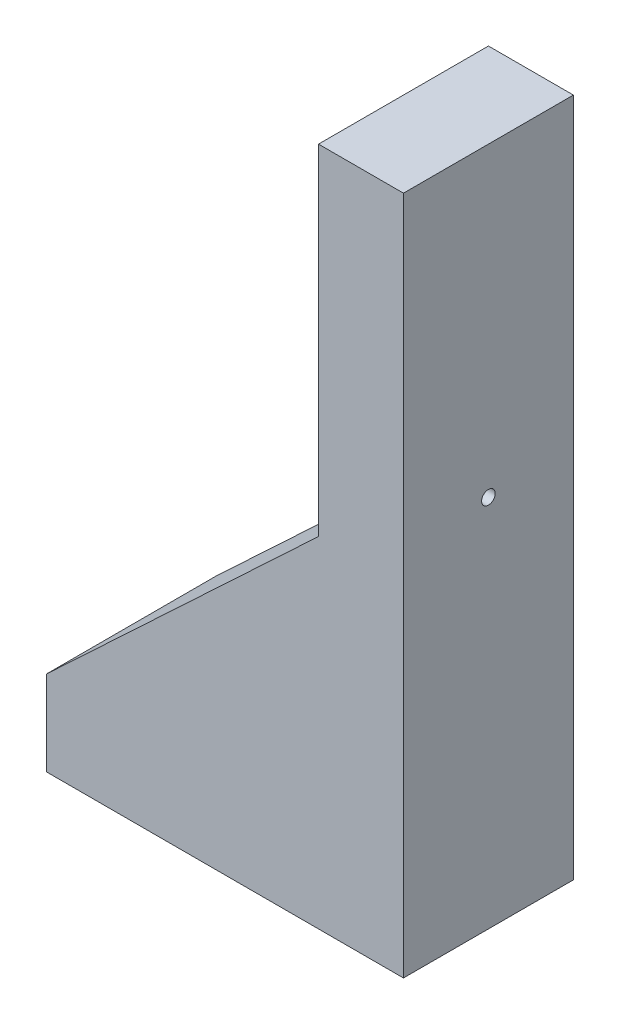
ISO-10303-21;
HEADER;
FILE_DESCRIPTION(('STEP AP214'),'2;1');
FILE_NAME('part.step','',(''),(''),'','','');
FILE_SCHEMA(('AUTOMOTIVE_DESIGN { 1 0 10303 214 1 1 1 1 }'));
ENDSEC;
DATA;
#1=APPLICATION_CONTEXT('core data for automotive mechanical design processes');
#2=APPLICATION_PROTOCOL_DEFINITION('international standard','automotive_design',2000,#1);
#3=PRODUCT_CONTEXT('',#1,'mechanical');
#4=PRODUCT('Part','Part','',(#3));
#5=PRODUCT_RELATED_PRODUCT_CATEGORY('part','',(#4));
#6=PRODUCT_DEFINITION_FORMATION('','',#4);
#7=PRODUCT_DEFINITION_CONTEXT('part definition',#1,'design');
#8=PRODUCT_DEFINITION('design','',#6,#7);
#9=PRODUCT_DEFINITION_SHAPE('','',#8);
#10=(LENGTH_UNIT() NAMED_UNIT(*) SI_UNIT(.MILLI.,.METRE.));
#11=(NAMED_UNIT(*) PLANE_ANGLE_UNIT() SI_UNIT($,.RADIAN.));
#12=(NAMED_UNIT(*) SI_UNIT($,.STERADIAN.) SOLID_ANGLE_UNIT());
#13=UNCERTAINTY_MEASURE_WITH_UNIT(LENGTH_MEASURE(1.E-05),#10,'distance_accuracy_value','');
#14=(GEOMETRIC_REPRESENTATION_CONTEXT(3) GLOBAL_UNCERTAINTY_ASSIGNED_CONTEXT((#13)) GLOBAL_UNIT_ASSIGNED_CONTEXT((#10,
#11,#12)) REPRESENTATION_CONTEXT('',''));
#15=CARTESIAN_POINT('',(0.,0.,0.));
#16=DIRECTION('',(0.,0.,1.));
#17=DIRECTION('',(1.,0.,0.));
#18=AXIS2_PLACEMENT_3D('',#15,#16,#17);
#19=CARTESIAN_POINT('',(-25.,97.8193146417446,50.));
#20=DIRECTION('',(0.,-1.,0.));
#21=DIRECTION('',(0.,0.,-1.));
#22=AXIS2_PLACEMENT_3D('',#19,#20,#21);
#23=PLANE('',#22);
#24=DIRECTION('',(-1.,0.,0.));
#25=VECTOR('',#24,1.);
#26=CARTESIAN_POINT('',(-25.,97.8193146417446,0.));
#27=LINE('',#26,#25);
#28=CARTESIAN_POINT('',(0.,97.8193146417446,0.));
#29=VERTEX_POINT('',#28);
#30=CARTESIAN_POINT('',(-25.,97.8193146417446,0.));
#31=VERTEX_POINT('',#30);
#32=EDGE_CURVE('E117',#29,#31,#27,.T.);
#33=ORIENTED_EDGE('',*,*,#32,.T.);
#34=DIRECTION('',(0.,0.,-1.));
#35=VECTOR('',#34,1.);
#36=CARTESIAN_POINT('',(-25.,97.8193146417446,50.));
#37=LINE('',#36,#35);
#38=CARTESIAN_POINT('',(-25.,97.8193146417446,50.));
#39=VERTEX_POINT('',#38);
#40=EDGE_CURVE('E11',#39,#31,#37,.T.);
#41=ORIENTED_EDGE('',*,*,#40,.F.);
#42=DIRECTION('',(-1.,0.,0.));
#43=VECTOR('',#42,1.);
#44=CARTESIAN_POINT('',(-25.,97.8193146417446,50.));
#45=LINE('',#44,#43);
#46=CARTESIAN_POINT('',(0.,97.8193146417446,50.));
#47=VERTEX_POINT('',#46);
#48=EDGE_CURVE('E128',#47,#39,#45,.T.);
#49=ORIENTED_EDGE('',*,*,#48,.F.);
#50=DIRECTION('',(0.,0.,-1.));
#51=VECTOR('',#50,1.);
#52=CARTESIAN_POINT('',(0.,97.8193146417446,50.));
#53=LINE('',#52,#51);
#54=EDGE_CURVE('E113',#47,#29,#53,.T.);
#55=ORIENTED_EDGE('',*,*,#54,.T.);
#56=EDGE_LOOP('',(#33,#41,#49,#55));
#57=FACE_BOUND('',#56,.T.);
#58=ADVANCED_FACE('F33',(#57),#23,.F.);
#59=CARTESIAN_POINT('',(-25.,-2.18068535825545,50.));
#60=DIRECTION('',(1.,0.,0.));
#61=DIRECTION('',(0.,0.,-1.));
#62=AXIS2_PLACEMENT_3D('',#59,#60,#61);
#63=PLANE('',#62);
#64=CARTESIAN_POINT('',(-25.,7.81931464174453,25.));
#65=DIRECTION('',(1.,0.,0.));
#66=DIRECTION('',(0.,0.,-1.));
#67=AXIS2_PLACEMENT_3D('',#64,#65,#66);
#68=CIRCLE('',#67,2.);
#69=CARTESIAN_POINT('',(-25.,7.81931464174453,23.));
#70=VERTEX_POINT('',#69);
#71=EDGE_CURVE('E121',#70,#70,#68,.T.);
#72=ORIENTED_EDGE('',*,*,#71,.T.);
#73=EDGE_LOOP('',(#72));
#74=FACE_BOUND('',#73,.T.);
#75=DIRECTION('',(0.,-1.,0.));
#76=VECTOR('',#75,1.);
#77=CARTESIAN_POINT('',(-25.,-2.18068535825545,0.));
#78=LINE('',#77,#76);
#79=CARTESIAN_POINT('',(-25.,-2.18068535825545,0.));
#80=VERTEX_POINT('',#79);
#81=EDGE_CURVE('E120',#31,#80,#78,.T.);
#82=ORIENTED_EDGE('',*,*,#81,.T.);
#83=DIRECTION('',(0.,0.,-1.));
#84=VECTOR('',#83,1.);
#85=CARTESIAN_POINT('',(-25.,-2.18068535825545,50.));
#86=LINE('',#85,#84);
#87=CARTESIAN_POINT('',(-25.,-2.18068535825545,50.));
#88=VERTEX_POINT('',#87);
#89=EDGE_CURVE('E41',#88,#80,#86,.T.);
#90=ORIENTED_EDGE('',*,*,#89,.F.);
#91=DIRECTION('',(0.,-1.,0.));
#92=VECTOR('',#91,1.);
#93=CARTESIAN_POINT('',(-25.,-2.18068535825545,50.));
#94=LINE('',#93,#92);
#95=EDGE_CURVE('E86',#39,#88,#94,.T.);
#96=ORIENTED_EDGE('',*,*,#95,.F.);
#97=ORIENTED_EDGE('',*,*,#40,.T.);
#98=EDGE_LOOP('',(#82,#90,#96,#97));
#99=FACE_BOUND('',#98,.T.);
#100=ADVANCED_FACE('F154',(#74,#99),#63,.F.);
#101=CARTESIAN_POINT('',(-105.,-77.1806853582555,50.));
#102=DIRECTION('',(0.683941128881329,-0.729537204140086,0.));
#103=DIRECTION('',(0.729537204140086,0.683941128881329,0.));
#104=AXIS2_PLACEMENT_3D('',#101,#102,#103);
#105=PLANE('',#104);
#106=DIRECTION('',(-0.729537204140086,-0.683941128881329,0.));
#107=VECTOR('',#106,1.);
#108=CARTESIAN_POINT('',(-105.,-77.1806853582555,0.));
#109=LINE('',#108,#107);
#110=CARTESIAN_POINT('',(-105.,-77.1806853582555,0.));
#111=VERTEX_POINT('',#110);
#112=EDGE_CURVE('E123',#80,#111,#109,.T.);
#113=ORIENTED_EDGE('',*,*,#112,.T.);
#114=DIRECTION('',(0.,0.,-1.));
#115=VECTOR('',#114,1.);
#116=CARTESIAN_POINT('',(-105.,-77.1806853582555,50.));
#117=LINE('',#116,#115);
#118=CARTESIAN_POINT('',(-105.,-77.1806853582555,50.));
#119=VERTEX_POINT('',#118);
#120=EDGE_CURVE('E108',#119,#111,#117,.T.);
#121=ORIENTED_EDGE('',*,*,#120,.F.);
#122=DIRECTION('',(-0.729537204140086,-0.683941128881329,0.));
#123=VECTOR('',#122,1.);
#124=CARTESIAN_POINT('',(-105.,-77.1806853582555,50.));
#125=LINE('',#124,#123);
#126=EDGE_CURVE('E99',#88,#119,#125,.T.);
#127=ORIENTED_EDGE('',*,*,#126,.F.);
#128=ORIENTED_EDGE('',*,*,#89,.T.);
#129=EDGE_LOOP('',(#113,#121,#127,#128));
#130=FACE_BOUND('',#129,.T.);
#131=ADVANCED_FACE('F134',(#130),#105,.F.);
#132=CARTESIAN_POINT('',(-105.,-102.180685358255,50.));
#133=DIRECTION('',(1.,0.,0.));
#134=DIRECTION('',(0.,1.,0.));
#135=AXIS2_PLACEMENT_3D('',#132,#133,#134);
#136=PLANE('',#135);
#137=DIRECTION('',(0.,-1.,0.));
#138=VECTOR('',#137,1.);
#139=CARTESIAN_POINT('',(-105.,-102.180685358255,0.));
#140=LINE('',#139,#138);
#141=CARTESIAN_POINT('',(-105.,-102.180685358255,0.));
#142=VERTEX_POINT('',#141);
#143=EDGE_CURVE('E107',#111,#142,#140,.T.);
#144=ORIENTED_EDGE('',*,*,#143,.T.);
#145=DIRECTION('',(0.,0.,-1.));
#146=VECTOR('',#145,1.);
#147=CARTESIAN_POINT('',(-105.,-102.180685358255,50.));
#148=LINE('',#147,#146);
#149=CARTESIAN_POINT('',(-105.,-102.180685358255,50.));
#150=VERTEX_POINT('',#149);
#151=EDGE_CURVE('E104',#150,#142,#148,.T.);
#152=ORIENTED_EDGE('',*,*,#151,.F.);
#153=DIRECTION('',(0.,-1.,0.));
#154=VECTOR('',#153,1.);
#155=CARTESIAN_POINT('',(-105.,-102.180685358255,50.));
#156=LINE('',#155,#154);
#157=EDGE_CURVE('E93',#119,#150,#156,.T.);
#158=ORIENTED_EDGE('',*,*,#157,.F.);
#159=ORIENTED_EDGE('',*,*,#120,.T.);
#160=EDGE_LOOP('',(#144,#152,#158,#159));
#161=FACE_BOUND('',#160,.T.);
#162=ADVANCED_FACE('F105',(#161),#136,.F.);
#163=CARTESIAN_POINT('',(0.,-102.180685358255,50.));
#164=DIRECTION('',(0.,1.,0.));
#165=DIRECTION('',(-1.,0.,0.));
#166=AXIS2_PLACEMENT_3D('',#163,#164,#165);
#167=PLANE('',#166);
#168=DIRECTION('',(1.,0.,0.));
#169=VECTOR('',#168,1.);
#170=CARTESIAN_POINT('',(0.,-102.180685358255,0.));
#171=LINE('',#170,#169);
#172=CARTESIAN_POINT('',(0.,-102.180685358255,0.));
#173=VERTEX_POINT('',#172);
#174=EDGE_CURVE('E72',#142,#173,#171,.T.);
#175=ORIENTED_EDGE('',*,*,#174,.T.);
#176=DIRECTION('',(0.,0.,-1.));
#177=VECTOR('',#176,1.);
#178=CARTESIAN_POINT('',(0.,-102.180685358255,50.));
#179=LINE('',#178,#177);
#180=CARTESIAN_POINT('',(0.,-102.180685358255,50.));
#181=VERTEX_POINT('',#180);
#182=EDGE_CURVE('E109',#181,#173,#179,.T.);
#183=ORIENTED_EDGE('',*,*,#182,.F.);
#184=DIRECTION('',(1.,0.,0.));
#185=VECTOR('',#184,1.);
#186=CARTESIAN_POINT('',(0.,-102.180685358255,50.));
#187=LINE('',#186,#185);
#188=EDGE_CURVE('E97',#150,#181,#187,.T.);
#189=ORIENTED_EDGE('',*,*,#188,.F.);
#190=ORIENTED_EDGE('',*,*,#151,.T.);
#191=EDGE_LOOP('',(#175,#183,#189,#190));
#192=FACE_BOUND('',#191,.T.);
#193=ADVANCED_FACE('F111',(#192),#167,.F.);
#194=CARTESIAN_POINT('',(0.,97.8193146417446,50.));
#195=DIRECTION('',(-1.,0.,0.));
#196=DIRECTION('',(0.,0.,1.));
#197=AXIS2_PLACEMENT_3D('',#194,#195,#196);
#198=PLANE('',#197);
#199=CARTESIAN_POINT('',(0.,7.81931464174453,25.));
#200=DIRECTION('',(1.,0.,0.));
#201=DIRECTION('',(0.,0.,-1.));
#202=AXIS2_PLACEMENT_3D('',#199,#200,#201);
#203=CIRCLE('',#202,2.);
#204=CARTESIAN_POINT('',(0.,7.81931464174453,23.));
#205=VERTEX_POINT('',#204);
#206=EDGE_CURVE('E214',#205,#205,#203,.T.);
#207=ORIENTED_EDGE('',*,*,#206,.F.);
#208=EDGE_LOOP('',(#207));
#209=FACE_BOUND('',#208,.T.);
#210=DIRECTION('',(0.,1.,0.));
#211=VECTOR('',#210,1.);
#212=CARTESIAN_POINT('',(0.,97.8193146417446,0.));
#213=LINE('',#212,#211);
#214=EDGE_CURVE('E78',#173,#29,#213,.T.);
#215=ORIENTED_EDGE('',*,*,#214,.T.);
#216=ORIENTED_EDGE('',*,*,#54,.F.);
#217=DIRECTION('',(0.,1.,0.));
#218=VECTOR('',#217,1.);
#219=CARTESIAN_POINT('',(0.,97.8193146417446,50.));
#220=LINE('',#219,#218);
#221=EDGE_CURVE('E49',#181,#47,#220,.T.);
#222=ORIENTED_EDGE('',*,*,#221,.F.);
#223=ORIENTED_EDGE('',*,*,#182,.T.);
#224=EDGE_LOOP('',(#215,#216,#222,#223));
#225=FACE_BOUND('',#224,.T.);
#226=ADVANCED_FACE('F141',(#209,#225),#198,.F.);
#227=CARTESIAN_POINT('',(0.,0.,50.));
#228=DIRECTION('',(0.,0.,-1.));
#229=DIRECTION('',(-1.,0.,0.));
#230=AXIS2_PLACEMENT_3D('',#227,#228,#229);
#231=PLANE('',#230);
#232=ORIENTED_EDGE('',*,*,#48,.T.);
#233=ORIENTED_EDGE('',*,*,#95,.T.);
#234=ORIENTED_EDGE('',*,*,#126,.T.);
#235=ORIENTED_EDGE('',*,*,#157,.T.);
#236=ORIENTED_EDGE('',*,*,#188,.T.);
#237=ORIENTED_EDGE('',*,*,#221,.T.);
#238=EDGE_LOOP('',(#232,#233,#234,#235,#236,#237));
#239=FACE_BOUND('',#238,.T.);
#240=ADVANCED_FACE('F95',(#239),#231,.F.);
#241=CARTESIAN_POINT('',(0.,0.,0.));
#242=DIRECTION('',(0.,0.,-1.));
#243=DIRECTION('',(-1.,0.,0.));
#244=AXIS2_PLACEMENT_3D('',#241,#242,#243);
#245=PLANE('',#244);
#246=ORIENTED_EDGE('',*,*,#32,.F.);
#247=ORIENTED_EDGE('',*,*,#214,.F.);
#248=ORIENTED_EDGE('',*,*,#174,.F.);
#249=ORIENTED_EDGE('',*,*,#143,.F.);
#250=ORIENTED_EDGE('',*,*,#112,.F.);
#251=ORIENTED_EDGE('',*,*,#81,.F.);
#252=EDGE_LOOP('',(#246,#247,#248,#249,#250,#251));
#253=FACE_BOUND('',#252,.T.);
#254=ADVANCED_FACE('F137',(#253),#245,.T.);
#255=CARTESIAN_POINT('',(-25.,7.81931464174453,25.));
#256=DIRECTION('',(1.,0.,0.));
#257=DIRECTION('',(0.,0.,-1.));
#258=AXIS2_PLACEMENT_3D('',#255,#256,#257);
#259=CYLINDRICAL_SURFACE('',#258,2.);
#260=ORIENTED_EDGE('',*,*,#71,.F.);
#261=EDGE_LOOP('',(#260));
#262=FACE_BOUND('',#261,.T.);
#263=ORIENTED_EDGE('',*,*,#206,.T.);
#264=EDGE_LOOP('',(#263));
#265=FACE_BOUND('',#264,.T.);
#266=ADVANCED_FACE('F189',(#262,#265),#259,.F.);
#267=CLOSED_SHELL('',(#58,#100,#131,#162,#193,#226,#240,#254,#266));
#268=MANIFOLD_SOLID_BREP('B2',#267);
#269=ADVANCED_BREP_SHAPE_REPRESENTATION('',(#18,#268),#14);
#270=SHAPE_DEFINITION_REPRESENTATION(#9,#269);
ENDSEC;
END-ISO-10303-21;
